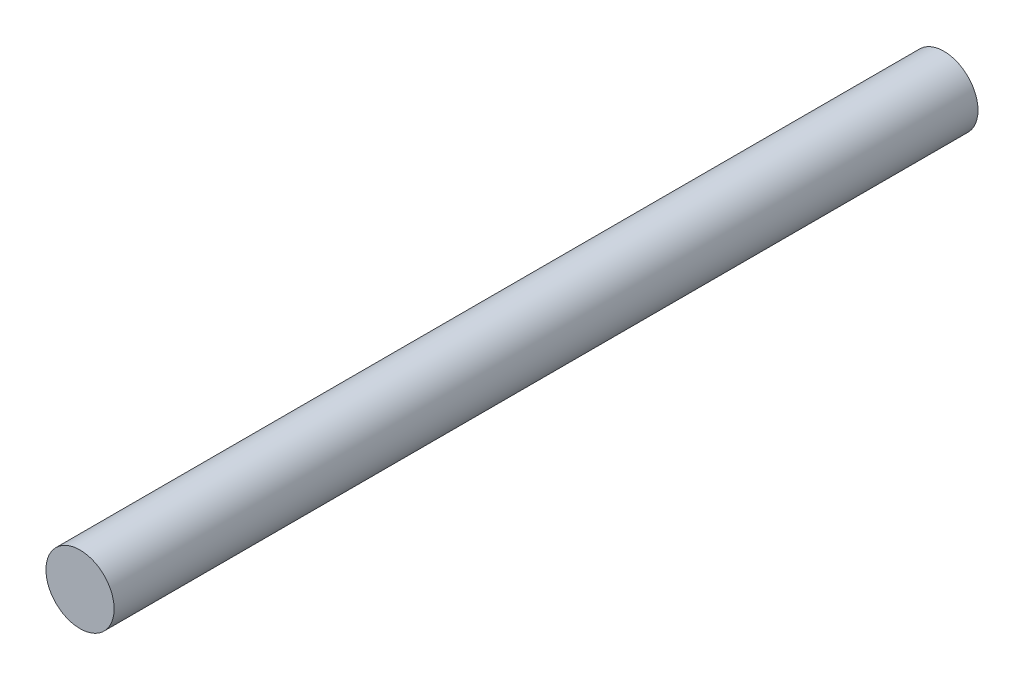
ISO-10303-21;
HEADER;
FILE_DESCRIPTION(('STEP AP214'),'2;1');
FILE_NAME('part.step','',(''),(''),'','','');
FILE_SCHEMA(('AUTOMOTIVE_DESIGN { 1 0 10303 214 1 1 1 1 }'));
ENDSEC;
DATA;
#1=APPLICATION_CONTEXT('core data for automotive mechanical design processes');
#2=APPLICATION_PROTOCOL_DEFINITION('international standard','automotive_design',2000,#1);
#3=PRODUCT_CONTEXT('',#1,'mechanical');
#4=PRODUCT('Part','Part','',(#3));
#5=PRODUCT_RELATED_PRODUCT_CATEGORY('part','',(#4));
#6=PRODUCT_DEFINITION_FORMATION('','',#4);
#7=PRODUCT_DEFINITION_CONTEXT('part definition',#1,'design');
#8=PRODUCT_DEFINITION('design','',#6,#7);
#9=PRODUCT_DEFINITION_SHAPE('','',#8);
#10=(LENGTH_UNIT() NAMED_UNIT(*) SI_UNIT(.MILLI.,.METRE.));
#11=(NAMED_UNIT(*) PLANE_ANGLE_UNIT() SI_UNIT($,.RADIAN.));
#12=(NAMED_UNIT(*) SI_UNIT($,.STERADIAN.) SOLID_ANGLE_UNIT());
#13=UNCERTAINTY_MEASURE_WITH_UNIT(LENGTH_MEASURE(1.E-05),#10,'distance_accuracy_value','');
#14=(GEOMETRIC_REPRESENTATION_CONTEXT(3) GLOBAL_UNCERTAINTY_ASSIGNED_CONTEXT((#13)) GLOBAL_UNIT_ASSIGNED_CONTEXT((#10,
#11,#12)) REPRESENTATION_CONTEXT('',''));
#15=CARTESIAN_POINT('',(0.,0.,0.));
#16=DIRECTION('',(0.,0.,1.));
#17=DIRECTION('',(1.,0.,0.));
#18=AXIS2_PLACEMENT_3D('',#15,#16,#17);
#19=CARTESIAN_POINT('',(-16.1370541189479,5.97451028251771,38.));
#20=DIRECTION('',(0.,0.,-1.));
#21=DIRECTION('',(-1.,0.,0.));
#22=AXIS2_PLACEMENT_3D('',#19,#20,#21);
#23=CYLINDRICAL_SURFACE('',#22,1.5);
#24=CARTESIAN_POINT('',(-16.1370541189479,5.97451028251771,38.));
#25=DIRECTION('',(0.,0.,1.));
#26=DIRECTION('',(1.,0.,0.));
#27=AXIS2_PLACEMENT_3D('',#24,#25,#26);
#28=CIRCLE('',#27,1.5);
#29=CARTESIAN_POINT('',(-14.6370541189479,5.97451028251771,38.));
#30=VERTEX_POINT('',#29);
#31=EDGE_CURVE('E10',#30,#30,#28,.T.);
#32=ORIENTED_EDGE('',*,*,#31,.F.);
#33=EDGE_LOOP('',(#32));
#34=FACE_BOUND('',#33,.T.);
#35=CARTESIAN_POINT('',(-16.1370541189479,5.97451028251771,0.));
#36=DIRECTION('',(0.,0.,1.));
#37=DIRECTION('',(1.,0.,0.));
#38=AXIS2_PLACEMENT_3D('',#35,#36,#37);
#39=CIRCLE('',#38,1.5);
#40=CARTESIAN_POINT('',(-14.6370541189479,5.97451028251771,0.));
#41=VERTEX_POINT('',#40);
#42=EDGE_CURVE('E33',#41,#41,#39,.T.);
#43=ORIENTED_EDGE('',*,*,#42,.T.);
#44=EDGE_LOOP('',(#43));
#45=FACE_BOUND('',#44,.T.);
#46=ADVANCED_FACE('F30',(#34,#45),#23,.T.);
#47=CARTESIAN_POINT('',(-16.1370541189479,5.97451028251771,38.));
#48=DIRECTION('',(0.,0.,1.));
#49=DIRECTION('',(1.,0.,0.));
#50=AXIS2_PLACEMENT_3D('',#47,#48,#49);
#51=PLANE('',#50);
#52=ORIENTED_EDGE('',*,*,#31,.T.);
#53=EDGE_LOOP('',(#52));
#54=FACE_BOUND('',#53,.T.);
#55=ADVANCED_FACE('F45',(#54),#51,.T.);
#56=CARTESIAN_POINT('',(-16.1370541189479,5.97451028251771,0.));
#57=DIRECTION('',(0.,0.,1.));
#58=DIRECTION('',(1.,0.,0.));
#59=AXIS2_PLACEMENT_3D('',#56,#57,#58);
#60=PLANE('',#59);
#61=ORIENTED_EDGE('',*,*,#42,.F.);
#62=EDGE_LOOP('',(#61));
#63=FACE_BOUND('',#62,.T.);
#64=ADVANCED_FACE('F43',(#63),#60,.F.);
#65=CLOSED_SHELL('',(#46,#55,#64));
#66=MANIFOLD_SOLID_BREP('B2',#65);
#67=ADVANCED_BREP_SHAPE_REPRESENTATION('',(#18,#66),#14);
#68=SHAPE_DEFINITION_REPRESENTATION(#9,#67);
ENDSEC;
END-ISO-10303-21;
